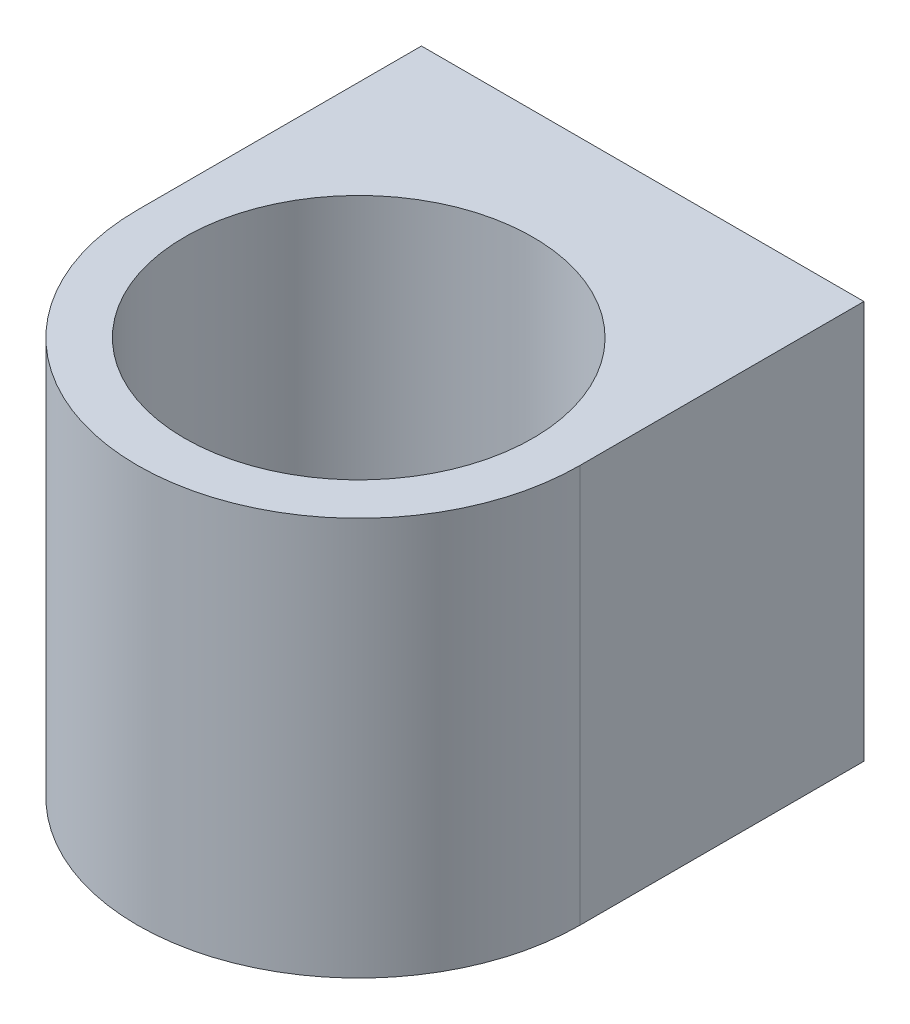
ISO-10303-21;
HEADER;
FILE_DESCRIPTION(('STEP AP214'),'2;1');
FILE_NAME('part.step','',(''),(''),'','','');
FILE_SCHEMA(('AUTOMOTIVE_DESIGN { 1 0 10303 214 1 1 1 1 }'));
ENDSEC;
DATA;
#1=APPLICATION_CONTEXT('core data for automotive mechanical design processes');
#2=APPLICATION_PROTOCOL_DEFINITION('international standard','automotive_design',2000,#1);
#3=PRODUCT_CONTEXT('',#1,'mechanical');
#4=PRODUCT('Part','Part','',(#3));
#5=PRODUCT_RELATED_PRODUCT_CATEGORY('part','',(#4));
#6=PRODUCT_DEFINITION_FORMATION('','',#4);
#7=PRODUCT_DEFINITION_CONTEXT('part definition',#1,'design');
#8=PRODUCT_DEFINITION('design','',#6,#7);
#9=PRODUCT_DEFINITION_SHAPE('','',#8);
#10=(LENGTH_UNIT() NAMED_UNIT(*) SI_UNIT(.MILLI.,.METRE.));
#11=(NAMED_UNIT(*) PLANE_ANGLE_UNIT() SI_UNIT($,.RADIAN.));
#12=(NAMED_UNIT(*) SI_UNIT($,.STERADIAN.) SOLID_ANGLE_UNIT());
#13=UNCERTAINTY_MEASURE_WITH_UNIT(LENGTH_MEASURE(1.E-05),#10,'distance_accuracy_value','');
#14=(GEOMETRIC_REPRESENTATION_CONTEXT(3) GLOBAL_UNCERTAINTY_ASSIGNED_CONTEXT((#13)) GLOBAL_UNIT_ASSIGNED_CONTEXT((#10,
#11,#12)) REPRESENTATION_CONTEXT('',''));
#15=CARTESIAN_POINT('',(0.,0.,0.));
#16=DIRECTION('',(0.,0.,1.));
#17=DIRECTION('',(1.,0.,0.));
#18=AXIS2_PLACEMENT_3D('',#15,#16,#17);
#19=CARTESIAN_POINT('',(14.1125,-12.7,-14.1125));
#20=DIRECTION('',(1.,0.,0.));
#21=DIRECTION('',(0.,0.,-1.));
#22=AXIS2_PLACEMENT_3D('',#19,#20,#21);
#23=PLANE('',#22);
#24=DIRECTION('',(0.,1.,0.));
#25=VECTOR('',#24,1.);
#26=CARTESIAN_POINT('',(14.1125,-12.7,-18.1125));
#27=LINE('',#26,#25);
#28=CARTESIAN_POINT('',(14.1125,-12.7,-18.1125));
#29=VERTEX_POINT('',#28);
#30=CARTESIAN_POINT('',(14.1125,12.7,-18.1125));
#31=VERTEX_POINT('',#30);
#32=EDGE_CURVE('E43',#29,#31,#27,.T.);
#33=ORIENTED_EDGE('',*,*,#32,.T.);
#34=DIRECTION('',(0.,0.,-1.));
#35=VECTOR('',#34,1.);
#36=CARTESIAN_POINT('',(14.1125,12.7,-18.1125));
#37=LINE('',#36,#35);
#38=CARTESIAN_POINT('',(14.1125,12.7,0.));
#39=VERTEX_POINT('',#38);
#40=EDGE_CURVE('E84',#39,#31,#37,.T.);
#41=ORIENTED_EDGE('',*,*,#40,.F.);
#42=DIRECTION('',(0.,1.,0.));
#43=VECTOR('',#42,1.);
#44=CARTESIAN_POINT('',(14.1125,-12.7,0.));
#45=LINE('',#44,#43);
#46=CARTESIAN_POINT('',(14.1125,-12.7,0.));
#47=VERTEX_POINT('',#46);
#48=EDGE_CURVE('E11',#47,#39,#45,.T.);
#49=ORIENTED_EDGE('',*,*,#48,.F.);
#50=DIRECTION('',(0.,0.,-1.));
#51=VECTOR('',#50,1.);
#52=CARTESIAN_POINT('',(14.1125,-12.7,-18.1125));
#53=LINE('',#52,#51);
#54=EDGE_CURVE('E56',#47,#29,#53,.T.);
#55=ORIENTED_EDGE('',*,*,#54,.T.);
#56=EDGE_LOOP('',(#33,#41,#49,#55));
#57=FACE_BOUND('',#56,.T.);
#58=ADVANCED_FACE('F39',(#57),#23,.T.);
#59=CARTESIAN_POINT('',(0.,-12.7,0.));
#60=DIRECTION('',(0.,1.,0.));
#61=DIRECTION('',(0.,0.,1.));
#62=AXIS2_PLACEMENT_3D('',#59,#60,#61);
#63=CYLINDRICAL_SURFACE('',#62,14.1125);
#64=ORIENTED_EDGE('',*,*,#48,.T.);
#65=CARTESIAN_POINT('',(0.,12.7,0.));
#66=DIRECTION('',(0.,1.,0.));
#67=DIRECTION('',(0.,0.,1.));
#68=AXIS2_PLACEMENT_3D('',#65,#66,#67);
#69=CIRCLE('',#68,14.1125);
#70=CARTESIAN_POINT('',(-14.1125,12.7,0.));
#71=VERTEX_POINT('',#70);
#72=EDGE_CURVE('E100',#71,#39,#69,.T.);
#73=ORIENTED_EDGE('',*,*,#72,.F.);
#74=DIRECTION('',(0.,1.,0.));
#75=VECTOR('',#74,1.);
#76=CARTESIAN_POINT('',(-14.1125,-12.7,0.));
#77=LINE('',#76,#75);
#78=CARTESIAN_POINT('',(-14.1125,-12.7,0.));
#79=VERTEX_POINT('',#78);
#80=EDGE_CURVE('E48',#79,#71,#77,.T.);
#81=ORIENTED_EDGE('',*,*,#80,.F.);
#82=CARTESIAN_POINT('',(0.,-12.7,0.));
#83=DIRECTION('',(0.,1.,0.));
#84=DIRECTION('',(0.,0.,1.));
#85=AXIS2_PLACEMENT_3D('',#82,#83,#84);
#86=CIRCLE('',#85,14.1125);
#87=EDGE_CURVE('E89',#79,#47,#86,.T.);
#88=ORIENTED_EDGE('',*,*,#87,.T.);
#89=EDGE_LOOP('',(#64,#73,#81,#88));
#90=FACE_BOUND('',#89,.T.);
#91=ADVANCED_FACE('F121',(#90),#63,.T.);
#92=CARTESIAN_POINT('',(-14.1125,-12.7,0.));
#93=DIRECTION('',(-1.,0.,0.));
#94=DIRECTION('',(0.,0.,1.));
#95=AXIS2_PLACEMENT_3D('',#92,#93,#94);
#96=PLANE('',#95);
#97=ORIENTED_EDGE('',*,*,#80,.T.);
#98=DIRECTION('',(0.,0.,1.));
#99=VECTOR('',#98,1.);
#100=CARTESIAN_POINT('',(-14.1125,12.7,-14.1125));
#101=LINE('',#100,#99);
#102=CARTESIAN_POINT('',(-14.1125,12.7,-18.1125));
#103=VERTEX_POINT('',#102);
#104=EDGE_CURVE('E95',#103,#71,#101,.T.);
#105=ORIENTED_EDGE('',*,*,#104,.F.);
#106=DIRECTION('',(0.,1.,0.));
#107=VECTOR('',#106,1.);
#108=CARTESIAN_POINT('',(-14.1125,-12.7,-18.1125));
#109=LINE('',#108,#107);
#110=CARTESIAN_POINT('',(-14.1125,-12.7,-18.1125));
#111=VERTEX_POINT('',#110);
#112=EDGE_CURVE('E88',#111,#103,#109,.T.);
#113=ORIENTED_EDGE('',*,*,#112,.F.);
#114=DIRECTION('',(0.,0.,1.));
#115=VECTOR('',#114,1.);
#116=CARTESIAN_POINT('',(-14.1125,-12.7,-14.1125));
#117=LINE('',#116,#115);
#118=EDGE_CURVE('E64',#111,#79,#117,.T.);
#119=ORIENTED_EDGE('',*,*,#118,.T.);
#120=EDGE_LOOP('',(#97,#105,#113,#119));
#121=FACE_BOUND('',#120,.T.);
#122=ADVANCED_FACE('F119',(#121),#96,.T.);
#123=CARTESIAN_POINT('',(-14.1125,-12.7,-18.1125));
#124=DIRECTION('',(0.,0.,-1.));
#125=DIRECTION('',(-1.,0.,0.));
#126=AXIS2_PLACEMENT_3D('',#123,#124,#125);
#127=PLANE('',#126);
#128=CARTESIAN_POINT('',(-8.1125,6.7,-18.1125));
#129=DIRECTION('',(0.,0.,-1.));
#130=DIRECTION('',(-1.,0.,0.));
#131=AXIS2_PLACEMENT_3D('',#128,#129,#130);
#132=CIRCLE('',#131,3.);
#133=CARTESIAN_POINT('',(-11.1125,6.7,-18.1125));
#134=VERTEX_POINT('',#133);
#135=EDGE_CURVE('E255',#134,#134,#132,.T.);
#136=ORIENTED_EDGE('',*,*,#135,.F.);
#137=EDGE_LOOP('',(#136));
#138=FACE_BOUND('',#137,.T.);
#139=CARTESIAN_POINT('',(8.1125,6.7,-18.1125));
#140=DIRECTION('',(0.,0.,-1.));
#141=DIRECTION('',(-1.,0.,0.));
#142=AXIS2_PLACEMENT_3D('',#139,#140,#141);
#143=CIRCLE('',#142,3.);
#144=CARTESIAN_POINT('',(5.1125,6.7,-18.1125));
#145=VERTEX_POINT('',#144);
#146=EDGE_CURVE('E254',#145,#145,#143,.T.);
#147=ORIENTED_EDGE('',*,*,#146,.F.);
#148=EDGE_LOOP('',(#147));
#149=FACE_BOUND('',#148,.T.);
#150=CARTESIAN_POINT('',(8.1125,-6.7,-18.1125));
#151=DIRECTION('',(0.,0.,-1.));
#152=DIRECTION('',(-1.,0.,0.));
#153=AXIS2_PLACEMENT_3D('',#150,#151,#152);
#154=CIRCLE('',#153,3.);
#155=CARTESIAN_POINT('',(5.1125,-6.7,-18.1125));
#156=VERTEX_POINT('',#155);
#157=EDGE_CURVE('E271',#156,#156,#154,.T.);
#158=ORIENTED_EDGE('',*,*,#157,.F.);
#159=EDGE_LOOP('',(#158));
#160=FACE_BOUND('',#159,.T.);
#161=CARTESIAN_POINT('',(-8.1125,-6.7,-18.1125));
#162=DIRECTION('',(0.,0.,-1.));
#163=DIRECTION('',(-1.,0.,0.));
#164=AXIS2_PLACEMENT_3D('',#161,#162,#163);
#165=CIRCLE('',#164,3.);
#166=CARTESIAN_POINT('',(-11.1125,-6.7,-18.1125));
#167=VERTEX_POINT('',#166);
#168=EDGE_CURVE('E265',#167,#167,#165,.T.);
#169=ORIENTED_EDGE('',*,*,#168,.F.);
#170=EDGE_LOOP('',(#169));
#171=FACE_BOUND('',#170,.T.);
#172=ORIENTED_EDGE('',*,*,#112,.T.);
#173=DIRECTION('',(-1.,0.,0.));
#174=VECTOR('',#173,1.);
#175=CARTESIAN_POINT('',(-14.1125,12.7,-18.1125));
#176=LINE('',#175,#174);
#177=EDGE_CURVE('E91',#31,#103,#176,.T.);
#178=ORIENTED_EDGE('',*,*,#177,.F.);
#179=ORIENTED_EDGE('',*,*,#32,.F.);
#180=DIRECTION('',(-1.,0.,0.));
#181=VECTOR('',#180,1.);
#182=CARTESIAN_POINT('',(-14.1125,-12.7,-18.1125));
#183=LINE('',#182,#181);
#184=EDGE_CURVE('E114',#29,#111,#183,.T.);
#185=ORIENTED_EDGE('',*,*,#184,.T.);
#186=EDGE_LOOP('',(#172,#178,#179,#185));
#187=FACE_BOUND('',#186,.T.);
#188=ADVANCED_FACE('F41',(#138,#149,#160,#171,#187),#127,.T.);
#189=CARTESIAN_POINT('',(0.,-12.7,0.));
#190=DIRECTION('',(0.,1.,0.));
#191=DIRECTION('',(0.,0.,1.));
#192=AXIS2_PLACEMENT_3D('',#189,#190,#191);
#193=PLANE('',#192);
#194=CARTESIAN_POINT('',(0.,-12.7,0.));
#195=DIRECTION('',(0.,1.,0.));
#196=DIRECTION('',(0.,0.,1.));
#197=AXIS2_PLACEMENT_3D('',#194,#195,#196);
#198=CIRCLE('',#197,11.1125);
#199=CARTESIAN_POINT('',(0.,-12.7,11.1125));
#200=VERTEX_POINT('',#199);
#201=EDGE_CURVE('E110',#200,#200,#198,.T.);
#202=ORIENTED_EDGE('',*,*,#201,.T.);
#203=EDGE_LOOP('',(#202));
#204=FACE_BOUND('',#203,.T.);
#205=ORIENTED_EDGE('',*,*,#54,.F.);
#206=ORIENTED_EDGE('',*,*,#87,.F.);
#207=ORIENTED_EDGE('',*,*,#118,.F.);
#208=ORIENTED_EDGE('',*,*,#184,.F.);
#209=EDGE_LOOP('',(#205,#206,#207,#208));
#210=FACE_BOUND('',#209,.T.);
#211=ADVANCED_FACE('F122',(#204,#210),#193,.F.);
#212=CARTESIAN_POINT('',(0.,-12.7,0.));
#213=DIRECTION('',(0.,1.,0.));
#214=DIRECTION('',(0.,0.,1.));
#215=AXIS2_PLACEMENT_3D('',#212,#213,#214);
#216=CYLINDRICAL_SURFACE('',#215,11.1125);
#217=ORIENTED_EDGE('',*,*,#201,.F.);
#218=EDGE_LOOP('',(#217));
#219=FACE_BOUND('',#218,.T.);
#220=CARTESIAN_POINT('',(0.,12.7,0.));
#221=DIRECTION('',(0.,1.,0.));
#222=DIRECTION('',(0.,0.,1.));
#223=AXIS2_PLACEMENT_3D('',#220,#221,#222);
#224=CIRCLE('',#223,11.1125);
#225=CARTESIAN_POINT('',(0.,12.7,11.1125));
#226=VERTEX_POINT('',#225);
#227=EDGE_CURVE('E101',#226,#226,#224,.T.);
#228=ORIENTED_EDGE('',*,*,#227,.T.);
#229=EDGE_LOOP('',(#228));
#230=FACE_BOUND('',#229,.T.);
#231=ADVANCED_FACE('F124',(#219,#230),#216,.F.);
#232=CARTESIAN_POINT('',(0.,12.7,0.));
#233=DIRECTION('',(0.,1.,0.));
#234=DIRECTION('',(0.,0.,1.));
#235=AXIS2_PLACEMENT_3D('',#232,#233,#234);
#236=PLANE('',#235);
#237=ORIENTED_EDGE('',*,*,#40,.T.);
#238=ORIENTED_EDGE('',*,*,#177,.T.);
#239=ORIENTED_EDGE('',*,*,#104,.T.);
#240=ORIENTED_EDGE('',*,*,#72,.T.);
#241=EDGE_LOOP('',(#237,#238,#239,#240));
#242=FACE_BOUND('',#241,.T.);
#243=ORIENTED_EDGE('',*,*,#227,.F.);
#244=EDGE_LOOP('',(#243));
#245=FACE_BOUND('',#244,.T.);
#246=ADVANCED_FACE('F97',(#242,#245),#236,.T.);
#247=CARTESIAN_POINT('',(-8.1125,-6.7,-11.1125));
#248=DIRECTION('',(0.,0.,-1.));
#249=DIRECTION('',(-1.,0.,0.));
#250=AXIS2_PLACEMENT_3D('',#247,#248,#249);
#251=CYLINDRICAL_SURFACE('',#250,3.);
#252=CARTESIAN_POINT('',(-8.1125,-6.7,-11.1125));
#253=DIRECTION('',(0.,0.,-1.));
#254=DIRECTION('',(-1.,0.,0.));
#255=AXIS2_PLACEMENT_3D('',#252,#253,#254);
#256=CIRCLE('',#255,3.);
#257=CARTESIAN_POINT('',(-11.1125,-6.7,-11.1125));
#258=VERTEX_POINT('',#257);
#259=EDGE_CURVE('E104',#258,#258,#256,.T.);
#260=ORIENTED_EDGE('',*,*,#259,.F.);
#261=EDGE_LOOP('',(#260));
#262=FACE_BOUND('',#261,.T.);
#263=ORIENTED_EDGE('',*,*,#168,.T.);
#264=EDGE_LOOP('',(#263));
#265=FACE_BOUND('',#264,.T.);
#266=ADVANCED_FACE('F160',(#262,#265),#251,.F.);
#267=CARTESIAN_POINT('',(-8.1125,-6.7,-11.1125));
#268=DIRECTION('',(0.,0.,-1.));
#269=DIRECTION('',(-1.,0.,0.));
#270=AXIS2_PLACEMENT_3D('',#267,#268,#269);
#271=PLANE('',#270);
#272=ORIENTED_EDGE('',*,*,#259,.T.);
#273=EDGE_LOOP('',(#272));
#274=FACE_BOUND('',#273,.T.);
#275=ADVANCED_FACE('F165',(#274),#271,.T.);
#276=CARTESIAN_POINT('',(8.1125,-6.7,-11.1125));
#277=DIRECTION('',(0.,0.,-1.));
#278=DIRECTION('',(-1.,0.,0.));
#279=AXIS2_PLACEMENT_3D('',#276,#277,#278);
#280=CYLINDRICAL_SURFACE('',#279,3.);
#281=CARTESIAN_POINT('',(8.1125,-6.7,-11.1125));
#282=DIRECTION('',(0.,0.,-1.));
#283=DIRECTION('',(-1.,0.,0.));
#284=AXIS2_PLACEMENT_3D('',#281,#282,#283);
#285=CIRCLE('',#284,3.);
#286=CARTESIAN_POINT('',(5.1125,-6.7,-11.1125));
#287=VERTEX_POINT('',#286);
#288=EDGE_CURVE('E267',#287,#287,#285,.T.);
#289=ORIENTED_EDGE('',*,*,#288,.F.);
#290=EDGE_LOOP('',(#289));
#291=FACE_BOUND('',#290,.T.);
#292=ORIENTED_EDGE('',*,*,#157,.T.);
#293=EDGE_LOOP('',(#292));
#294=FACE_BOUND('',#293,.T.);
#295=ADVANCED_FACE('F175',(#291,#294),#280,.F.);
#296=CARTESIAN_POINT('',(8.1125,-6.7,-11.1125));
#297=DIRECTION('',(0.,0.,-1.));
#298=DIRECTION('',(-1.,0.,0.));
#299=AXIS2_PLACEMENT_3D('',#296,#297,#298);
#300=PLANE('',#299);
#301=ORIENTED_EDGE('',*,*,#288,.T.);
#302=EDGE_LOOP('',(#301));
#303=FACE_BOUND('',#302,.T.);
#304=ADVANCED_FACE('F185',(#303),#300,.T.);
#305=CARTESIAN_POINT('',(8.1125,6.7,-11.1125));
#306=DIRECTION('',(0.,0.,-1.));
#307=DIRECTION('',(-1.,0.,0.));
#308=AXIS2_PLACEMENT_3D('',#305,#306,#307);
#309=CYLINDRICAL_SURFACE('',#308,3.);
#310=CARTESIAN_POINT('',(8.1125,6.7,-11.1125));
#311=DIRECTION('',(0.,0.,-1.));
#312=DIRECTION('',(-1.,0.,0.));
#313=AXIS2_PLACEMENT_3D('',#310,#311,#312);
#314=CIRCLE('',#313,3.);
#315=CARTESIAN_POINT('',(5.1125,6.7,-11.1125));
#316=VERTEX_POINT('',#315);
#317=EDGE_CURVE('E258',#316,#316,#314,.T.);
#318=ORIENTED_EDGE('',*,*,#317,.F.);
#319=EDGE_LOOP('',(#318));
#320=FACE_BOUND('',#319,.T.);
#321=ORIENTED_EDGE('',*,*,#146,.T.);
#322=EDGE_LOOP('',(#321));
#323=FACE_BOUND('',#322,.T.);
#324=ADVANCED_FACE('F195',(#320,#323),#309,.F.);
#325=CARTESIAN_POINT('',(8.1125,6.7,-11.1125));
#326=DIRECTION('',(0.,0.,-1.));
#327=DIRECTION('',(-1.,0.,0.));
#328=AXIS2_PLACEMENT_3D('',#325,#326,#327);
#329=PLANE('',#328);
#330=ORIENTED_EDGE('',*,*,#317,.T.);
#331=EDGE_LOOP('',(#330));
#332=FACE_BOUND('',#331,.T.);
#333=ADVANCED_FACE('F205',(#332),#329,.T.);
#334=CARTESIAN_POINT('',(-8.1125,6.7,-11.1125));
#335=DIRECTION('',(0.,0.,-1.));
#336=DIRECTION('',(-1.,0.,0.));
#337=AXIS2_PLACEMENT_3D('',#334,#335,#336);
#338=CYLINDRICAL_SURFACE('',#337,3.);
#339=CARTESIAN_POINT('',(-8.1125,6.7,-11.1125));
#340=DIRECTION('',(0.,0.,-1.));
#341=DIRECTION('',(-1.,0.,0.));
#342=AXIS2_PLACEMENT_3D('',#339,#340,#341);
#343=CIRCLE('',#342,3.);
#344=CARTESIAN_POINT('',(-11.1125,6.7,-11.1125));
#345=VERTEX_POINT('',#344);
#346=EDGE_CURVE('E253',#345,#345,#343,.T.);
#347=ORIENTED_EDGE('',*,*,#346,.F.);
#348=EDGE_LOOP('',(#347));
#349=FACE_BOUND('',#348,.T.);
#350=ORIENTED_EDGE('',*,*,#135,.T.);
#351=EDGE_LOOP('',(#350));
#352=FACE_BOUND('',#351,.T.);
#353=ADVANCED_FACE('F215',(#349,#352),#338,.F.);
#354=CARTESIAN_POINT('',(-8.1125,6.7,-11.1125));
#355=DIRECTION('',(0.,0.,-1.));
#356=DIRECTION('',(-1.,0.,0.));
#357=AXIS2_PLACEMENT_3D('',#354,#355,#356);
#358=PLANE('',#357);
#359=ORIENTED_EDGE('',*,*,#346,.T.);
#360=EDGE_LOOP('',(#359));
#361=FACE_BOUND('',#360,.T.);
#362=ADVANCED_FACE('F225',(#361),#358,.T.);
#363=CLOSED_SHELL('',(#58,#91,#122,#188,#211,#231,#246,#266,#275,#295,#304,#324,#333,#353,#362));
#364=MANIFOLD_SOLID_BREP('B2',#363);
#365=ADVANCED_BREP_SHAPE_REPRESENTATION('',(#18,#364),#14);
#366=SHAPE_DEFINITION_REPRESENTATION(#9,#365);
ENDSEC;
END-ISO-10303-21;
